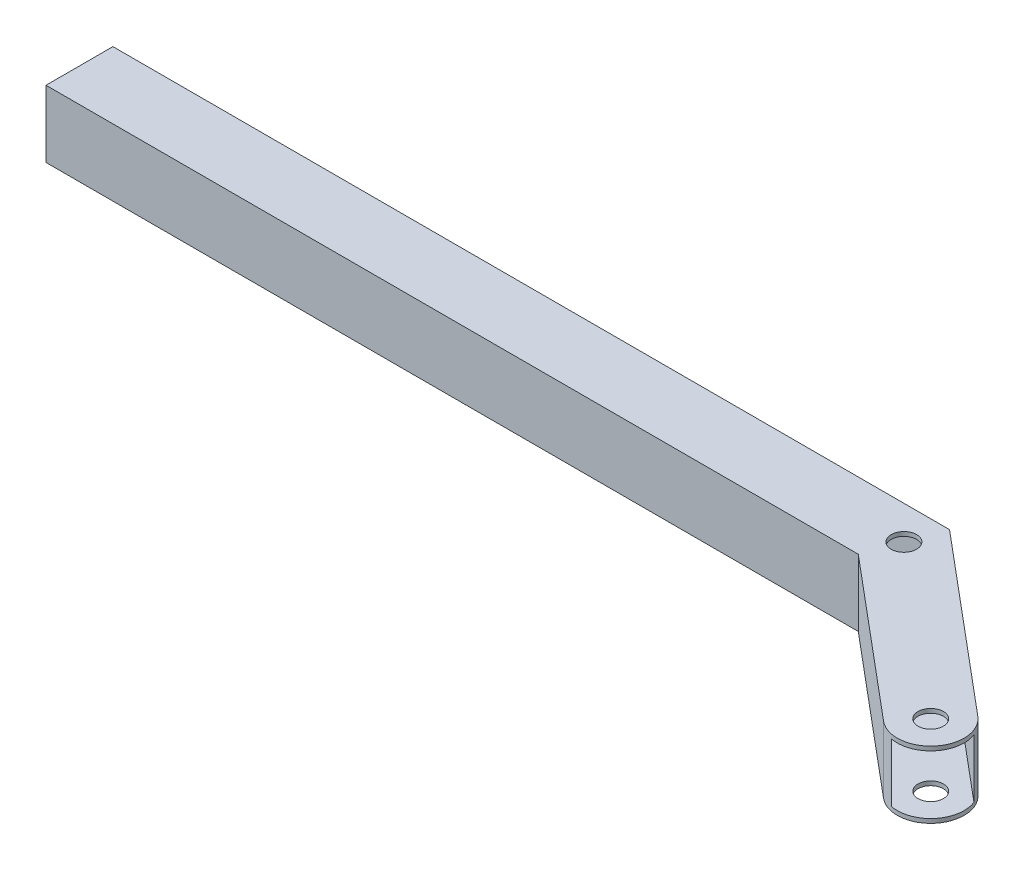
ISO-10303-21;
HEADER;
FILE_DESCRIPTION(('STEP AP214'),'2;1');
FILE_NAME('part.step','',(''),(''),'','','');
FILE_SCHEMA(('AUTOMOTIVE_DESIGN { 1 0 10303 214 1 1 1 1 }'));
ENDSEC;
DATA;
#1=APPLICATION_CONTEXT('core data for automotive mechanical design processes');
#2=APPLICATION_PROTOCOL_DEFINITION('international standard','automotive_design',2000,#1);
#3=PRODUCT_CONTEXT('',#1,'mechanical');
#4=PRODUCT('Part','Part','',(#3));
#5=PRODUCT_RELATED_PRODUCT_CATEGORY('part','',(#4));
#6=PRODUCT_DEFINITION_FORMATION('','',#4);
#7=PRODUCT_DEFINITION_CONTEXT('part definition',#1,'design');
#8=PRODUCT_DEFINITION('design','',#6,#7);
#9=PRODUCT_DEFINITION_SHAPE('','',#8);
#10=(LENGTH_UNIT() NAMED_UNIT(*) SI_UNIT(.MILLI.,.METRE.));
#11=(NAMED_UNIT(*) PLANE_ANGLE_UNIT() SI_UNIT($,.RADIAN.));
#12=(NAMED_UNIT(*) SI_UNIT($,.STERADIAN.) SOLID_ANGLE_UNIT());
#13=UNCERTAINTY_MEASURE_WITH_UNIT(LENGTH_MEASURE(1.E-05),#10,'distance_accuracy_value','');
#14=(GEOMETRIC_REPRESENTATION_CONTEXT(3) GLOBAL_UNCERTAINTY_ASSIGNED_CONTEXT((#13)) GLOBAL_UNIT_ASSIGNED_CONTEXT((#10,
#11,#12)) REPRESENTATION_CONTEXT('',''));
#15=CARTESIAN_POINT('',(0.,0.,0.));
#16=DIRECTION('',(0.,0.,1.));
#17=DIRECTION('',(1.,0.,0.));
#18=AXIS2_PLACEMENT_3D('',#15,#16,#17);
#19=CARTESIAN_POINT('',(189.382955981188,1.5875,1.66702581812776));
#20=DIRECTION('',(0.,-1.,0.));
#21=DIRECTION('',(0.,0.,-1.));
#22=AXIS2_PLACEMENT_3D('',#19,#20,#21);
#23=PLANE('',#22);
#24=CARTESIAN_POINT('',(126.145987201716,1.5875,-51.3950913614962));
#25=DIRECTION('',(0.,-1.,0.));
#26=DIRECTION('',(0.,0.,-1.));
#27=AXIS2_PLACEMENT_3D('',#24,#25,#26);
#28=CIRCLE('',#27,4.82599999999999);
#29=CARTESIAN_POINT('',(126.145987201716,1.5875,-56.2210913614962));
#30=VERTEX_POINT('',#29);
#31=EDGE_CURVE('E390',#30,#30,#28,.T.);
#32=ORIENTED_EDGE('',*,*,#31,.T.);
#33=EDGE_LOOP('',(#32));
#34=FACE_BOUND('',#33,.T.);
#35=CARTESIAN_POINT('',(189.382955981188,1.5875,1.66702581812773));
#36=DIRECTION('',(0.,-1.,0.));
#37=DIRECTION('',(0.,0.,-1.));
#38=AXIS2_PLACEMENT_3D('',#35,#36,#37);
#39=CIRCLE('',#38,4.82599999999999);
#40=CARTESIAN_POINT('',(189.382955981188,1.5875,-3.15897418187226));
#41=VERTEX_POINT('',#40);
#42=EDGE_CURVE('E175',#41,#41,#39,.T.);
#43=ORIENTED_EDGE('',*,*,#42,.T.);
#44=EDGE_LOOP('',(#43));
#45=FACE_BOUND('',#44,.T.);
#46=DIRECTION('',(-0.766044443118976,0.,-0.642787609686541));
#47=VECTOR('',#46,1.);
#48=CARTESIAN_POINT('',(122.101367909716,1.5875,-40.2825913614963));
#49=LINE('',#48,#47);
#50=CARTESIAN_POINT('',(186.949896485493,1.5875,14.1317850488274));
#51=VERTEX_POINT('',#50);
#52=CARTESIAN_POINT('',(122.101367909716,1.5875,-40.2825913614963));
#53=VERTEX_POINT('',#52);
#54=EDGE_CURVE('E55',#51,#53,#49,.T.);
#55=ORIENTED_EDGE('',*,*,#54,.F.);
#56=CARTESIAN_POINT('',(189.382955981188,1.5875,1.66702581812776));
#57=DIRECTION('',(0.,1.,0.));
#58=DIRECTION('',(0.,0.,-1.));
#59=AXIS2_PLACEMENT_3D('',#56,#57,#58);
#60=CIRCLE('',#59,12.7000000468073);
#61=CARTESIAN_POINT('',(201.235851163428,1.5875,-2.89355276224286));
#62=VERTEX_POINT('',#61);
#63=EDGE_CURVE('E261',#51,#62,#60,.T.);
#64=ORIENTED_EDGE('',*,*,#63,.T.);
#65=DIRECTION('',(0.766044443118984,0.,0.642787609686532));
#66=VECTOR('',#65,1.);
#67=CARTESIAN_POINT('',(130.768409293014,1.5875,-62.0227572457122));
#68=LINE('',#67,#66);
#69=CARTESIAN_POINT('',(130.768409293014,1.5875,-62.0227572457122));
#70=VERTEX_POINT('',#69);
#71=EDGE_CURVE('E209',#70,#62,#68,.T.);
#72=ORIENTED_EDGE('',*,*,#71,.F.);
#73=DIRECTION('',(0.,0.,1.));
#74=VECTOR('',#73,1.);
#75=CARTESIAN_POINT('',(130.768409293014,1.5875,-62.0227572457122));
#76=LINE('',#75,#74);
#77=CARTESIAN_POINT('',(130.768409293014,1.5875,-62.5075913614962));
#78=VERTEX_POINT('',#77);
#79=EDGE_CURVE('E236',#78,#70,#76,.T.);
#80=ORIENTED_EDGE('',*,*,#79,.F.);
#81=DIRECTION('',(1.,0.,0.));
#82=VECTOR('',#81,1.);
#83=CARTESIAN_POINT('',(130.190606493716,1.5875,-62.5075913614962));
#84=LINE('',#83,#82);
#85=CARTESIAN_POINT('',(130.190606493716,1.5875,-62.5075913614962));
#86=VERTEX_POINT('',#85);
#87=EDGE_CURVE('E233',#86,#78,#84,.T.);
#88=ORIENTED_EDGE('',*,*,#87,.F.);
#89=DIRECTION('',(0.766044443119002,0.,0.64278760968651));
#90=VECTOR('',#89,1.);
#91=CARTESIAN_POINT('',(129.747983870096,1.5875,-62.878995841727));
#92=LINE('',#91,#90);
#93=CARTESIAN_POINT('',(129.747983870096,1.5875,-62.878995841727));
#94=VERTEX_POINT('',#93);
#95=EDGE_CURVE('E230',#94,#86,#92,.T.);
#96=ORIENTED_EDGE('',*,*,#95,.F.);
#97=DIRECTION('',(0.642787609686567,0.,-0.766044443118955));
#98=VECTOR('',#97,1.);
#99=CARTESIAN_POINT('',(129.436338507716,1.5875,-62.5075913614962));
#100=LINE('',#99,#98);
#101=CARTESIAN_POINT('',(129.436338507716,1.5875,-62.5075913614962));
#102=VERTEX_POINT('',#101);
#103=EDGE_CURVE('E227',#102,#94,#100,.T.);
#104=ORIENTED_EDGE('',*,*,#103,.F.);
#105=DIRECTION('',(1.,0.,0.));
#106=VECTOR('',#105,1.);
#107=CARTESIAN_POINT('',(-186.782012798284,1.5875,-62.5075913614962));
#108=LINE('',#107,#106);
#109=CARTESIAN_POINT('',(-186.782012798284,1.5875,-62.5075913614962));
#110=VERTEX_POINT('',#109);
#111=EDGE_CURVE('E204',#110,#102,#108,.T.);
#112=ORIENTED_EDGE('',*,*,#111,.F.);
#113=DIRECTION('',(0.,0.,1.));
#114=VECTOR('',#113,1.);
#115=CARTESIAN_POINT('',(-186.782012798284,1.5875,-38.6950913614963));
#116=LINE('',#115,#114);
#117=CARTESIAN_POINT('',(-186.782012798284,1.5875,-40.2825913614963));
#118=VERTEX_POINT('',#117);
#119=EDGE_CURVE('E263',#110,#118,#116,.T.);
#120=ORIENTED_EDGE('',*,*,#119,.T.);
#121=DIRECTION('',(-1.,0.,0.));
#122=VECTOR('',#121,1.);
#123=CARTESIAN_POINT('',(-186.782012798284,1.5875,-40.2825913614963));
#124=LINE('',#123,#122);
#125=EDGE_CURVE('E51',#53,#118,#124,.T.);
#126=ORIENTED_EDGE('',*,*,#125,.F.);
#127=EDGE_LOOP('',(#55,#64,#72,#80,#88,#96,#104,#112,#120,#126));
#128=FACE_BOUND('',#127,.T.);
#129=ADVANCED_FACE('F36',(#34,#45,#128),#23,.F.);
#130=CARTESIAN_POINT('',(121.523565153716,1.5875,-38.6950913614963));
#131=DIRECTION('',(0.642787609686541,0.,-0.766044443118976));
#132=DIRECTION('',(-0.766044443118977,0.,-0.642787609686541));
#133=AXIS2_PLACEMENT_3D('',#130,#131,#132);
#134=PLANE('',#133);
#135=DIRECTION('',(0.766044443118977,0.,0.642787609686541));
#136=VECTOR('',#135,1.);
#137=CARTESIAN_POINT('',(121.523565153716,0.,-38.6950913614963));
#138=LINE('',#137,#136);
#139=CARTESIAN_POINT('',(121.523565153716,0.,-38.6950913614963));
#140=VERTEX_POINT('',#139);
#141=CARTESIAN_POINT('',(181.219553308082,0.,11.3957902815952));
#142=VERTEX_POINT('',#141);
#143=EDGE_CURVE('E152',#140,#142,#138,.T.);
#144=ORIENTED_EDGE('',*,*,#143,.T.);
#145=DIRECTION('',(0.,-1.,0.));
#146=VECTOR('',#145,1.);
#147=CARTESIAN_POINT('',(181.219553308082,1.5875,11.3957902815952));
#148=LINE('',#147,#146);
#149=CARTESIAN_POINT('',(181.219553308082,25.4,11.3957902815952));
#150=VERTEX_POINT('',#149);
#151=EDGE_CURVE('E11',#150,#142,#148,.T.);
#152=ORIENTED_EDGE('',*,*,#151,.F.);
#153=DIRECTION('',(0.766044443118977,0.,0.642787609686541));
#154=VECTOR('',#153,1.);
#155=CARTESIAN_POINT('',(121.523565153716,25.4,-38.6950913614963));
#156=LINE('',#155,#154);
#157=CARTESIAN_POINT('',(121.523565153716,25.4,-38.6950913614963));
#158=VERTEX_POINT('',#157);
#159=EDGE_CURVE('E150',#158,#150,#156,.T.);
#160=ORIENTED_EDGE('',*,*,#159,.F.);
#161=DIRECTION('',(0.,-1.,0.));
#162=VECTOR('',#161,1.);
#163=CARTESIAN_POINT('',(121.523565153716,1.5875,-38.6950913614963));
#164=LINE('',#163,#162);
#165=EDGE_CURVE('E266',#158,#140,#164,.T.);
#166=ORIENTED_EDGE('',*,*,#165,.T.);
#167=EDGE_LOOP('',(#144,#152,#160,#166));
#168=FACE_BOUND('',#167,.T.);
#169=ADVANCED_FACE('F38',(#168),#134,.F.);
#170=CARTESIAN_POINT('',(189.382955981188,1.5875,1.66702581812776));
#171=DIRECTION('',(0.,-1.,0.));
#172=DIRECTION('',(0.,0.,-1.));
#173=AXIS2_PLACEMENT_3D('',#170,#171,#172);
#174=CYLINDRICAL_SURFACE('',#173,12.7000000468073);
#175=DIRECTION('',(0.,-1.,0.));
#176=VECTOR('',#175,1.);
#177=CARTESIAN_POINT('',(197.546358654294,1.5875,-8.06173864533968));
#178=LINE('',#177,#176);
#179=CARTESIAN_POINT('',(197.546358654294,25.4,-8.06173864533971));
#180=VERTEX_POINT('',#179);
#181=CARTESIAN_POINT('',(197.546358654294,0.,-8.06173864533968));
#182=VERTEX_POINT('',#181);
#183=EDGE_CURVE('E44',#180,#182,#178,.T.);
#184=ORIENTED_EDGE('',*,*,#183,.F.);
#185=CARTESIAN_POINT('',(189.382955981188,25.4,1.66702581812774));
#186=DIRECTION('',(0.,1.,0.));
#187=DIRECTION('',(0.,0.,-1.));
#188=AXIS2_PLACEMENT_3D('',#185,#186,#187);
#189=CIRCLE('',#188,12.7000000468073);
#190=EDGE_CURVE('E155',#150,#180,#189,.T.);
#191=ORIENTED_EDGE('',*,*,#190,.F.);
#192=ORIENTED_EDGE('',*,*,#151,.T.);
#193=CARTESIAN_POINT('',(189.382955981188,0.,1.66702581812776));
#194=DIRECTION('',(0.,1.,0.));
#195=DIRECTION('',(0.,0.,-1.));
#196=AXIS2_PLACEMENT_3D('',#193,#194,#195);
#197=CIRCLE('',#196,12.7000000468073);
#198=EDGE_CURVE('E268',#142,#182,#197,.T.);
#199=ORIENTED_EDGE('',*,*,#198,.T.);
#200=EDGE_LOOP('',(#184,#191,#192,#199));
#201=FACE_BOUND('',#200,.T.);
#202=CARTESIAN_POINT('',(189.382955981188,23.8125,1.66702581812774));
#203=DIRECTION('',(0.,1.,0.));
#204=DIRECTION('',(0.,0.,-1.));
#205=AXIS2_PLACEMENT_3D('',#202,#203,#204);
#206=CIRCLE('',#205,12.7000000468073);
#207=CARTESIAN_POINT('',(186.949896398707,23.8125,14.1317849760051));
#208=VERTEX_POINT('',#207);
#209=CARTESIAN_POINT('',(201.235851163428,23.8125,-2.89355276224282));
#210=VERTEX_POINT('',#209);
#211=EDGE_CURVE('E172',#208,#210,#206,.T.);
#212=ORIENTED_EDGE('',*,*,#211,.T.);
#213=DIRECTION('',(0.,-1.,0.));
#214=VECTOR('',#213,1.);
#215=CARTESIAN_POINT('',(201.235851163428,23.8125,-2.89355276224282));
#216=LINE('',#215,#214);
#217=EDGE_CURVE('E224',#210,#62,#216,.T.);
#218=ORIENTED_EDGE('',*,*,#217,.T.);
#219=ORIENTED_EDGE('',*,*,#63,.F.);
#220=DIRECTION('',(0.,-1.,0.));
#221=VECTOR('',#220,1.);
#222=CARTESIAN_POINT('',(186.949896398707,23.8125,14.1317849760051));
#223=LINE('',#222,#221);
#224=EDGE_CURVE('E201',#208,#51,#223,.T.);
#225=ORIENTED_EDGE('',*,*,#224,.F.);
#226=EDGE_LOOP('',(#212,#218,#219,#225));
#227=FACE_BOUND('',#226,.T.);
#228=ADVANCED_FACE('F156',(#201,#227),#174,.T.);
#229=CARTESIAN_POINT('',(130.768409249716,1.5875,-64.0950913614962));
#230=DIRECTION('',(-0.642787609686541,0.,0.766044443118977));
#231=DIRECTION('',(0.766044443118977,0.,0.642787609686541));
#232=AXIS2_PLACEMENT_3D('',#229,#230,#231);
#233=PLANE('',#232);
#234=DIRECTION('',(-0.766044443118977,0.,-0.642787609686541));
#235=VECTOR('',#234,1.);
#236=CARTESIAN_POINT('',(130.768409249716,0.,-64.0950913614962));
#237=LINE('',#236,#235);
#238=CARTESIAN_POINT('',(130.768409249716,0.,-64.0950913614962));
#239=VERTEX_POINT('',#238);
#240=EDGE_CURVE('E270',#182,#239,#237,.T.);
#241=ORIENTED_EDGE('',*,*,#240,.T.);
#242=DIRECTION('',(0.,-1.,0.));
#243=VECTOR('',#242,1.);
#244=CARTESIAN_POINT('',(130.768409249716,1.5875,-64.0950913614962));
#245=LINE('',#244,#243);
#246=CARTESIAN_POINT('',(130.768409249716,25.4,-64.0950913614962));
#247=VERTEX_POINT('',#246);
#248=EDGE_CURVE('E284',#247,#239,#245,.T.);
#249=ORIENTED_EDGE('',*,*,#248,.F.);
#250=DIRECTION('',(-0.766044443118977,0.,-0.642787609686541));
#251=VECTOR('',#250,1.);
#252=CARTESIAN_POINT('',(130.768409249716,25.4,-64.0950913614962));
#253=LINE('',#252,#251);
#254=EDGE_CURVE('E162',#180,#247,#253,.T.);
#255=ORIENTED_EDGE('',*,*,#254,.F.);
#256=ORIENTED_EDGE('',*,*,#183,.T.);
#257=EDGE_LOOP('',(#241,#249,#255,#256));
#258=FACE_BOUND('',#257,.T.);
#259=ADVANCED_FACE('F288',(#258),#233,.F.);
#260=CARTESIAN_POINT('',(-186.782012798284,1.5875,-64.0950913614962));
#261=DIRECTION('',(0.,0.,1.));
#262=DIRECTION('',(1.,0.,0.));
#263=AXIS2_PLACEMENT_3D('',#260,#261,#262);
#264=PLANE('',#263);
#265=DIRECTION('',(-1.,0.,0.));
#266=VECTOR('',#265,1.);
#267=CARTESIAN_POINT('',(-186.782012798284,0.,-64.0950913614962));
#268=LINE('',#267,#266);
#269=CARTESIAN_POINT('',(-186.782012798284,0.,-64.0950913614962));
#270=VERTEX_POINT('',#269);
#271=EDGE_CURVE('E272',#239,#270,#268,.T.);
#272=ORIENTED_EDGE('',*,*,#271,.T.);
#273=DIRECTION('',(0.,-1.,0.));
#274=VECTOR('',#273,1.);
#275=CARTESIAN_POINT('',(-186.782012798284,1.5875,-64.0950913614962));
#276=LINE('',#275,#274);
#277=CARTESIAN_POINT('',(-186.782012798284,25.4,-64.0950913614962));
#278=VERTEX_POINT('',#277);
#279=EDGE_CURVE('E281',#278,#270,#276,.T.);
#280=ORIENTED_EDGE('',*,*,#279,.F.);
#281=DIRECTION('',(-1.,0.,0.));
#282=VECTOR('',#281,1.);
#283=CARTESIAN_POINT('',(-186.782012798284,25.4,-64.0950913614962));
#284=LINE('',#283,#282);
#285=EDGE_CURVE('E179',#247,#278,#284,.T.);
#286=ORIENTED_EDGE('',*,*,#285,.F.);
#287=ORIENTED_EDGE('',*,*,#248,.T.);
#288=EDGE_LOOP('',(#272,#280,#286,#287));
#289=FACE_BOUND('',#288,.T.);
#290=ADVANCED_FACE('F295',(#289),#264,.F.);
#291=CARTESIAN_POINT('',(-186.782012798284,1.5875,-38.6950913614963));
#292=DIRECTION('',(1.,0.,0.));
#293=DIRECTION('',(0.,0.,-1.));
#294=AXIS2_PLACEMENT_3D('',#291,#292,#293);
#295=PLANE('',#294);
#296=DIRECTION('',(0.,-1.,0.));
#297=VECTOR('',#296,1.);
#298=CARTESIAN_POINT('',(-186.782012798284,23.8125,-62.5075913614962));
#299=LINE('',#298,#297);
#300=CARTESIAN_POINT('',(-186.782012798284,23.8125,-62.5075913614962));
#301=VERTEX_POINT('',#300);
#302=EDGE_CURVE('E258',#301,#110,#299,.T.);
#303=ORIENTED_EDGE('',*,*,#302,.F.);
#304=DIRECTION('',(0.,0.,1.));
#305=VECTOR('',#304,1.);
#306=CARTESIAN_POINT('',(-186.782012798284,23.8125,-38.6950913614963));
#307=LINE('',#306,#305);
#308=CARTESIAN_POINT('',(-186.782012798284,23.8125,-40.2825913614963));
#309=VERTEX_POINT('',#308);
#310=EDGE_CURVE('E169',#301,#309,#307,.T.);
#311=ORIENTED_EDGE('',*,*,#310,.T.);
#312=DIRECTION('',(0.,-1.,0.));
#313=VECTOR('',#312,1.);
#314=CARTESIAN_POINT('',(-186.782012798284,23.8125,-40.2825913614963));
#315=LINE('',#314,#313);
#316=EDGE_CURVE('E193',#309,#118,#315,.T.);
#317=ORIENTED_EDGE('',*,*,#316,.T.);
#318=ORIENTED_EDGE('',*,*,#119,.F.);
#319=EDGE_LOOP('',(#303,#311,#317,#318));
#320=FACE_BOUND('',#319,.T.);
#321=DIRECTION('',(0.,0.,1.));
#322=VECTOR('',#321,1.);
#323=CARTESIAN_POINT('',(-186.782012798284,0.,-38.6950913614963));
#324=LINE('',#323,#322);
#325=CARTESIAN_POINT('',(-186.782012798284,0.,-38.6950913614963));
#326=VERTEX_POINT('',#325);
#327=EDGE_CURVE('E274',#270,#326,#324,.T.);
#328=ORIENTED_EDGE('',*,*,#327,.T.);
#329=DIRECTION('',(0.,-1.,0.));
#330=VECTOR('',#329,1.);
#331=CARTESIAN_POINT('',(-186.782012798284,1.5875,-38.6950913614963));
#332=LINE('',#331,#330);
#333=CARTESIAN_POINT('',(-186.782012798284,25.4,-38.6950913614963));
#334=VERTEX_POINT('',#333);
#335=EDGE_CURVE('E278',#334,#326,#332,.T.);
#336=ORIENTED_EDGE('',*,*,#335,.F.);
#337=DIRECTION('',(0.,0.,1.));
#338=VECTOR('',#337,1.);
#339=CARTESIAN_POINT('',(-186.782012798284,25.4,-38.6950913614963));
#340=LINE('',#339,#338);
#341=EDGE_CURVE('E182',#278,#334,#340,.T.);
#342=ORIENTED_EDGE('',*,*,#341,.F.);
#343=ORIENTED_EDGE('',*,*,#279,.T.);
#344=EDGE_LOOP('',(#328,#336,#342,#343));
#345=FACE_BOUND('',#344,.T.);
#346=ADVANCED_FACE('F299',(#320,#345),#295,.F.);
#347=CARTESIAN_POINT('',(121.523565153716,1.5875,-38.6950913614963));
#348=DIRECTION('',(0.,0.,-1.));
#349=DIRECTION('',(-1.,0.,0.));
#350=AXIS2_PLACEMENT_3D('',#347,#348,#349);
#351=PLANE('',#350);
#352=DIRECTION('',(1.,0.,0.));
#353=VECTOR('',#352,1.);
#354=CARTESIAN_POINT('',(121.523565153716,0.,-38.6950913614963));
#355=LINE('',#354,#353);
#356=EDGE_CURVE('E264',#326,#140,#355,.T.);
#357=ORIENTED_EDGE('',*,*,#356,.T.);
#358=ORIENTED_EDGE('',*,*,#165,.F.);
#359=DIRECTION('',(1.,0.,0.));
#360=VECTOR('',#359,1.);
#361=CARTESIAN_POINT('',(121.523565153716,25.4,-38.6950913614963));
#362=LINE('',#361,#360);
#363=EDGE_CURVE('E168',#334,#158,#362,.T.);
#364=ORIENTED_EDGE('',*,*,#363,.F.);
#365=ORIENTED_EDGE('',*,*,#335,.T.);
#366=EDGE_LOOP('',(#357,#358,#364,#365));
#367=FACE_BOUND('',#366,.T.);
#368=ADVANCED_FACE('F301',(#367),#351,.F.);
#369=CARTESIAN_POINT('',(189.382955981188,0.,1.66702581812776));
#370=DIRECTION('',(0.,-1.,0.));
#371=DIRECTION('',(0.,0.,-1.));
#372=AXIS2_PLACEMENT_3D('',#369,#370,#371);
#373=PLANE('',#372);
#374=CARTESIAN_POINT('',(126.145987201716,0.,-51.3950913614962));
#375=DIRECTION('',(0.,1.,0.));
#376=DIRECTION('',(0.,0.,1.));
#377=AXIS2_PLACEMENT_3D('',#374,#375,#376);
#378=CIRCLE('',#377,4.82599999999999);
#379=CARTESIAN_POINT('',(126.145987201716,0.,-46.5690913614962));
#380=VERTEX_POINT('',#379);
#381=EDGE_CURVE('E384',#380,#380,#378,.T.);
#382=ORIENTED_EDGE('',*,*,#381,.T.);
#383=EDGE_LOOP('',(#382));
#384=FACE_BOUND('',#383,.T.);
#385=CARTESIAN_POINT('',(189.382955981188,0.,1.66702581812773));
#386=DIRECTION('',(0.,1.,0.));
#387=DIRECTION('',(0.,0.,1.));
#388=AXIS2_PLACEMENT_3D('',#385,#386,#387);
#389=CIRCLE('',#388,4.82599999999999);
#390=CARTESIAN_POINT('',(189.382955981188,0.,6.49302581812772));
#391=VERTEX_POINT('',#390);
#392=EDGE_CURVE('E393',#391,#391,#389,.T.);
#393=ORIENTED_EDGE('',*,*,#392,.T.);
#394=EDGE_LOOP('',(#393));
#395=FACE_BOUND('',#394,.T.);
#396=ORIENTED_EDGE('',*,*,#143,.F.);
#397=ORIENTED_EDGE('',*,*,#356,.F.);
#398=ORIENTED_EDGE('',*,*,#327,.F.);
#399=ORIENTED_EDGE('',*,*,#271,.F.);
#400=ORIENTED_EDGE('',*,*,#240,.F.);
#401=ORIENTED_EDGE('',*,*,#198,.F.);
#402=EDGE_LOOP('',(#396,#397,#398,#399,#400,#401));
#403=FACE_BOUND('',#402,.T.);
#404=ADVANCED_FACE('F291',(#384,#395,#403),#373,.T.);
#405=CARTESIAN_POINT('',(-186.782012798284,23.8125,-62.5075913614962));
#406=DIRECTION('',(0.,0.,-1.));
#407=DIRECTION('',(-1.,0.,0.));
#408=AXIS2_PLACEMENT_3D('',#405,#406,#407);
#409=PLANE('',#408);
#410=ORIENTED_EDGE('',*,*,#111,.T.);
#411=DIRECTION('',(0.,-1.,0.));
#412=VECTOR('',#411,1.);
#413=CARTESIAN_POINT('',(129.436338507716,23.8125,-62.5075913614962));
#414=LINE('',#413,#412);
#415=CARTESIAN_POINT('',(129.436338507716,23.8125,-62.5075913614962));
#416=VERTEX_POINT('',#415);
#417=EDGE_CURVE('E255',#416,#102,#414,.T.);
#418=ORIENTED_EDGE('',*,*,#417,.F.);
#419=DIRECTION('',(1.,0.,0.));
#420=VECTOR('',#419,1.);
#421=CARTESIAN_POINT('',(-186.782012798284,23.8125,-62.5075913614962));
#422=LINE('',#421,#420);
#423=EDGE_CURVE('E205',#301,#416,#422,.T.);
#424=ORIENTED_EDGE('',*,*,#423,.F.);
#425=ORIENTED_EDGE('',*,*,#302,.T.);
#426=EDGE_LOOP('',(#410,#418,#424,#425));
#427=FACE_BOUND('',#426,.T.);
#428=ADVANCED_FACE('F309',(#427),#409,.F.);
#429=CARTESIAN_POINT('',(129.436338507716,23.8125,-62.5075913614962));
#430=DIRECTION('',(-0.766044443118955,0.,-0.642787609686567));
#431=DIRECTION('',(-0.642787609686567,0.,0.766044443118955));
#432=AXIS2_PLACEMENT_3D('',#429,#430,#431);
#433=PLANE('',#432);
#434=ORIENTED_EDGE('',*,*,#103,.T.);
#435=DIRECTION('',(0.,-1.,0.));
#436=VECTOR('',#435,1.);
#437=CARTESIAN_POINT('',(129.747983870096,23.8125,-62.878995841727));
#438=LINE('',#437,#436);
#439=CARTESIAN_POINT('',(129.747983870096,23.8125,-62.878995841727));
#440=VERTEX_POINT('',#439);
#441=EDGE_CURVE('E252',#440,#94,#438,.T.);
#442=ORIENTED_EDGE('',*,*,#441,.F.);
#443=DIRECTION('',(0.642787609686567,0.,-0.766044443118955));
#444=VECTOR('',#443,1.);
#445=CARTESIAN_POINT('',(129.436338507716,23.8125,-62.5075913614962));
#446=LINE('',#445,#444);
#447=EDGE_CURVE('E208',#416,#440,#446,.T.);
#448=ORIENTED_EDGE('',*,*,#447,.F.);
#449=ORIENTED_EDGE('',*,*,#417,.T.);
#450=EDGE_LOOP('',(#434,#442,#448,#449));
#451=FACE_BOUND('',#450,.T.);
#452=ADVANCED_FACE('F326',(#451),#433,.F.);
#453=CARTESIAN_POINT('',(129.747983870096,23.8125,-62.878995841727));
#454=DIRECTION('',(0.642787609686511,0.,-0.766044443119002));
#455=DIRECTION('',(-0.766044443119002,0.,-0.642787609686511));
#456=AXIS2_PLACEMENT_3D('',#453,#454,#455);
#457=PLANE('',#456);
#458=ORIENTED_EDGE('',*,*,#95,.T.);
#459=DIRECTION('',(0.,-1.,0.));
#460=VECTOR('',#459,1.);
#461=CARTESIAN_POINT('',(130.190606493716,23.8125,-62.5075913614962));
#462=LINE('',#461,#460);
#463=CARTESIAN_POINT('',(130.190606493716,23.8125,-62.5075913614962));
#464=VERTEX_POINT('',#463);
#465=EDGE_CURVE('E249',#464,#86,#462,.T.);
#466=ORIENTED_EDGE('',*,*,#465,.F.);
#467=DIRECTION('',(0.766044443119002,0.,0.64278760968651));
#468=VECTOR('',#467,1.);
#469=CARTESIAN_POINT('',(129.747983870096,23.8125,-62.878995841727));
#470=LINE('',#469,#468);
#471=EDGE_CURVE('E212',#440,#464,#470,.T.);
#472=ORIENTED_EDGE('',*,*,#471,.F.);
#473=ORIENTED_EDGE('',*,*,#441,.T.);
#474=EDGE_LOOP('',(#458,#466,#472,#473));
#475=FACE_BOUND('',#474,.T.);
#476=ADVANCED_FACE('F330',(#475),#457,.F.);
#477=CARTESIAN_POINT('',(130.190606493716,23.8125,-62.5075913614962));
#478=DIRECTION('',(0.,0.,-1.));
#479=DIRECTION('',(-1.,0.,0.));
#480=AXIS2_PLACEMENT_3D('',#477,#478,#479);
#481=PLANE('',#480);
#482=ORIENTED_EDGE('',*,*,#87,.T.);
#483=DIRECTION('',(0.,-1.,0.));
#484=VECTOR('',#483,1.);
#485=CARTESIAN_POINT('',(130.768409293014,23.8125,-62.5075913614962));
#486=LINE('',#485,#484);
#487=CARTESIAN_POINT('',(130.768409293014,23.8125,-62.5075913614962));
#488=VERTEX_POINT('',#487);
#489=EDGE_CURVE('E246',#488,#78,#486,.T.);
#490=ORIENTED_EDGE('',*,*,#489,.F.);
#491=DIRECTION('',(1.,0.,0.));
#492=VECTOR('',#491,1.);
#493=CARTESIAN_POINT('',(130.190606493716,23.8125,-62.5075913614962));
#494=LINE('',#493,#492);
#495=EDGE_CURVE('E215',#464,#488,#494,.T.);
#496=ORIENTED_EDGE('',*,*,#495,.F.);
#497=ORIENTED_EDGE('',*,*,#465,.T.);
#498=EDGE_LOOP('',(#482,#490,#496,#497));
#499=FACE_BOUND('',#498,.T.);
#500=ADVANCED_FACE('F334',(#499),#481,.F.);
#501=CARTESIAN_POINT('',(130.768409293014,23.8125,-62.0227572457122));
#502=DIRECTION('',(1.,0.,0.));
#503=DIRECTION('',(0.,0.,-1.));
#504=AXIS2_PLACEMENT_3D('',#501,#502,#503);
#505=PLANE('',#504);
#506=ORIENTED_EDGE('',*,*,#79,.T.);
#507=DIRECTION('',(0.,-1.,0.));
#508=VECTOR('',#507,1.);
#509=CARTESIAN_POINT('',(130.768409293014,23.8125,-62.0227572457122));
#510=LINE('',#509,#508);
#511=CARTESIAN_POINT('',(130.768409293014,23.8125,-62.0227572457122));
#512=VERTEX_POINT('',#511);
#513=EDGE_CURVE('E243',#512,#70,#510,.T.);
#514=ORIENTED_EDGE('',*,*,#513,.F.);
#515=DIRECTION('',(0.,0.,1.));
#516=VECTOR('',#515,1.);
#517=CARTESIAN_POINT('',(130.768409293014,23.8125,-62.0227572457122));
#518=LINE('',#517,#516);
#519=EDGE_CURVE('E218',#488,#512,#518,.T.);
#520=ORIENTED_EDGE('',*,*,#519,.F.);
#521=ORIENTED_EDGE('',*,*,#489,.T.);
#522=EDGE_LOOP('',(#506,#514,#520,#521));
#523=FACE_BOUND('',#522,.T.);
#524=ADVANCED_FACE('F338',(#523),#505,.F.);
#525=CARTESIAN_POINT('',(130.768409293014,23.8125,-62.0227572457122));
#526=DIRECTION('',(0.642787609686532,0.,-0.766044443118984));
#527=DIRECTION('',(-0.766044443118984,0.,-0.642787609686532));
#528=AXIS2_PLACEMENT_3D('',#525,#526,#527);
#529=PLANE('',#528);
#530=ORIENTED_EDGE('',*,*,#71,.T.);
#531=ORIENTED_EDGE('',*,*,#217,.F.);
#532=DIRECTION('',(0.766044443118984,0.,0.642787609686532));
#533=VECTOR('',#532,1.);
#534=CARTESIAN_POINT('',(130.768409293014,23.8125,-62.0227572457122));
#535=LINE('',#534,#533);
#536=EDGE_CURVE('E221',#512,#210,#535,.T.);
#537=ORIENTED_EDGE('',*,*,#536,.F.);
#538=ORIENTED_EDGE('',*,*,#513,.T.);
#539=EDGE_LOOP('',(#530,#531,#537,#538));
#540=FACE_BOUND('',#539,.T.);
#541=ADVANCED_FACE('F342',(#540),#529,.F.);
#542=CARTESIAN_POINT('',(122.101367909716,23.8125,-40.2825913614963));
#543=DIRECTION('',(-0.642787609686541,0.,0.766044443118976));
#544=DIRECTION('',(0.766044443118976,0.,0.642787609686541));
#545=AXIS2_PLACEMENT_3D('',#542,#543,#544);
#546=PLANE('',#545);
#547=ORIENTED_EDGE('',*,*,#54,.T.);
#548=DIRECTION('',(0.,-1.,0.));
#549=VECTOR('',#548,1.);
#550=CARTESIAN_POINT('',(122.101367909716,23.8125,-40.2825913614963));
#551=LINE('',#550,#549);
#552=CARTESIAN_POINT('',(122.101367909716,23.8125,-40.2825913614963));
#553=VERTEX_POINT('',#552);
#554=EDGE_CURVE('E198',#553,#53,#551,.T.);
#555=ORIENTED_EDGE('',*,*,#554,.F.);
#556=DIRECTION('',(-0.766044443118976,0.,-0.642787609686541));
#557=VECTOR('',#556,1.);
#558=CARTESIAN_POINT('',(122.101367909716,23.8125,-40.2825913614963));
#559=LINE('',#558,#557);
#560=EDGE_CURVE('E187',#208,#553,#559,.T.);
#561=ORIENTED_EDGE('',*,*,#560,.F.);
#562=ORIENTED_EDGE('',*,*,#224,.T.);
#563=EDGE_LOOP('',(#547,#555,#561,#562));
#564=FACE_BOUND('',#563,.T.);
#565=ADVANCED_FACE('F346',(#564),#546,.F.);
#566=CARTESIAN_POINT('',(-186.782012798284,23.8125,-40.2825913614963));
#567=DIRECTION('',(0.,0.,1.));
#568=DIRECTION('',(1.,0.,0.));
#569=AXIS2_PLACEMENT_3D('',#566,#567,#568);
#570=PLANE('',#569);
#571=ORIENTED_EDGE('',*,*,#125,.T.);
#572=ORIENTED_EDGE('',*,*,#316,.F.);
#573=DIRECTION('',(-1.,0.,0.));
#574=VECTOR('',#573,1.);
#575=CARTESIAN_POINT('',(-186.782012798284,23.8125,-40.2825913614963));
#576=LINE('',#575,#574);
#577=EDGE_CURVE('E190',#553,#309,#576,.T.);
#578=ORIENTED_EDGE('',*,*,#577,.F.);
#579=ORIENTED_EDGE('',*,*,#554,.T.);
#580=EDGE_LOOP('',(#571,#572,#578,#579));
#581=FACE_BOUND('',#580,.T.);
#582=ADVANCED_FACE('F350',(#581),#570,.F.);
#583=CARTESIAN_POINT('',(189.382955981188,23.8125,1.66702581812774));
#584=DIRECTION('',(0.,-1.,0.));
#585=DIRECTION('',(0.,0.,-1.));
#586=AXIS2_PLACEMENT_3D('',#583,#584,#585);
#587=PLANE('',#586);
#588=CARTESIAN_POINT('',(126.145987201716,23.8125,-51.3950913614962));
#589=DIRECTION('',(0.,-1.,0.));
#590=DIRECTION('',(0.,0.,-1.));
#591=AXIS2_PLACEMENT_3D('',#588,#589,#590);
#592=CIRCLE('',#591,4.82599999999999);
#593=CARTESIAN_POINT('',(126.145987201716,23.8125,-56.2210913614962));
#594=VERTEX_POINT('',#593);
#595=EDGE_CURVE('E380',#594,#594,#592,.T.);
#596=ORIENTED_EDGE('',*,*,#595,.F.);
#597=EDGE_LOOP('',(#596));
#598=FACE_BOUND('',#597,.T.);
#599=CARTESIAN_POINT('',(189.382955981188,23.8125,1.66702581812773));
#600=DIRECTION('',(0.,-1.,0.));
#601=DIRECTION('',(0.,0.,-1.));
#602=AXIS2_PLACEMENT_3D('',#599,#600,#601);
#603=CIRCLE('',#602,4.82599999999999);
#604=CARTESIAN_POINT('',(189.382955981188,23.8125,-3.15897418187226));
#605=VERTEX_POINT('',#604);
#606=EDGE_CURVE('E396',#605,#605,#603,.T.);
#607=ORIENTED_EDGE('',*,*,#606,.F.);
#608=EDGE_LOOP('',(#607));
#609=FACE_BOUND('',#608,.T.);
#610=ORIENTED_EDGE('',*,*,#423,.T.);
#611=ORIENTED_EDGE('',*,*,#447,.T.);
#612=ORIENTED_EDGE('',*,*,#471,.T.);
#613=ORIENTED_EDGE('',*,*,#495,.T.);
#614=ORIENTED_EDGE('',*,*,#519,.T.);
#615=ORIENTED_EDGE('',*,*,#536,.T.);
#616=ORIENTED_EDGE('',*,*,#211,.F.);
#617=ORIENTED_EDGE('',*,*,#560,.T.);
#618=ORIENTED_EDGE('',*,*,#577,.T.);
#619=ORIENTED_EDGE('',*,*,#310,.F.);
#620=EDGE_LOOP('',(#610,#611,#612,#613,#614,#615,#616,#617,#618,#619));
#621=FACE_BOUND('',#620,.T.);
#622=ADVANCED_FACE('F354',(#598,#609,#621),#587,.T.);
#623=CARTESIAN_POINT('',(189.382955981188,25.4,1.66702581812774));
#624=DIRECTION('',(0.,-1.,0.));
#625=DIRECTION('',(0.,0.,-1.));
#626=AXIS2_PLACEMENT_3D('',#623,#624,#625);
#627=PLANE('',#626);
#628=CARTESIAN_POINT('',(126.145987201716,25.4,-51.3950913614962));
#629=DIRECTION('',(0.,1.,0.));
#630=DIRECTION('',(0.,0.,1.));
#631=AXIS2_PLACEMENT_3D('',#628,#629,#630);
#632=CIRCLE('',#631,4.82599999999999);
#633=CARTESIAN_POINT('',(126.145987201716,25.4,-46.5690913614962));
#634=VERTEX_POINT('',#633);
#635=EDGE_CURVE('E383',#634,#634,#632,.T.);
#636=ORIENTED_EDGE('',*,*,#635,.F.);
#637=EDGE_LOOP('',(#636));
#638=FACE_BOUND('',#637,.T.);
#639=CARTESIAN_POINT('',(189.382955981188,25.4,1.66702581812773));
#640=DIRECTION('',(0.,1.,0.));
#641=DIRECTION('',(0.,0.,1.));
#642=AXIS2_PLACEMENT_3D('',#639,#640,#641);
#643=CIRCLE('',#642,4.82599999999999);
#644=CARTESIAN_POINT('',(189.382955981188,25.4,6.49302581812772));
#645=VERTEX_POINT('',#644);
#646=EDGE_CURVE('E392',#645,#645,#643,.T.);
#647=ORIENTED_EDGE('',*,*,#646,.F.);
#648=EDGE_LOOP('',(#647));
#649=FACE_BOUND('',#648,.T.);
#650=ORIENTED_EDGE('',*,*,#159,.T.);
#651=ORIENTED_EDGE('',*,*,#190,.T.);
#652=ORIENTED_EDGE('',*,*,#254,.T.);
#653=ORIENTED_EDGE('',*,*,#285,.T.);
#654=ORIENTED_EDGE('',*,*,#341,.T.);
#655=ORIENTED_EDGE('',*,*,#363,.T.);
#656=EDGE_LOOP('',(#650,#651,#652,#653,#654,#655));
#657=FACE_BOUND('',#656,.T.);
#658=ADVANCED_FACE('F165',(#638,#649,#657),#627,.F.);
#659=CARTESIAN_POINT('',(189.382955981188,0.,1.66702581812773));
#660=DIRECTION('',(0.,1.,0.));
#661=DIRECTION('',(0.,0.,1.));
#662=AXIS2_PLACEMENT_3D('',#659,#660,#661);
#663=CYLINDRICAL_SURFACE('',#662,4.82599999999999);
#664=ORIENTED_EDGE('',*,*,#606,.T.);
#665=EDGE_LOOP('',(#664));
#666=FACE_BOUND('',#665,.T.);
#667=ORIENTED_EDGE('',*,*,#646,.T.);
#668=EDGE_LOOP('',(#667));
#669=FACE_BOUND('',#668,.T.);
#670=ADVANCED_FACE('F361',(#666,#669),#663,.F.);
#671=ORIENTED_EDGE('',*,*,#392,.F.);
#672=EDGE_LOOP('',(#671));
#673=FACE_BOUND('',#672,.T.);
#674=ORIENTED_EDGE('',*,*,#42,.F.);
#675=EDGE_LOOP('',(#674));
#676=FACE_BOUND('',#675,.T.);
#677=ADVANCED_FACE('F365',(#673,#676),#663,.F.);
#678=CARTESIAN_POINT('',(126.145987201716,0.,-51.3950913614962));
#679=DIRECTION('',(0.,1.,0.));
#680=DIRECTION('',(0.,0.,1.));
#681=AXIS2_PLACEMENT_3D('',#678,#679,#680);
#682=CYLINDRICAL_SURFACE('',#681,4.82599999999999);
#683=ORIENTED_EDGE('',*,*,#595,.T.);
#684=EDGE_LOOP('',(#683));
#685=FACE_BOUND('',#684,.T.);
#686=ORIENTED_EDGE('',*,*,#635,.T.);
#687=EDGE_LOOP('',(#686));
#688=FACE_BOUND('',#687,.T.);
#689=ADVANCED_FACE('F367',(#685,#688),#682,.F.);
#690=ORIENTED_EDGE('',*,*,#381,.F.);
#691=EDGE_LOOP('',(#690));
#692=FACE_BOUND('',#691,.T.);
#693=ORIENTED_EDGE('',*,*,#31,.F.);
#694=EDGE_LOOP('',(#693));
#695=FACE_BOUND('',#694,.T.);
#696=ADVANCED_FACE('F369',(#692,#695),#682,.F.);
#697=CLOSED_SHELL('',(#129,#169,#228,#259,#290,#346,#368,#404,#428,#452,#476,#500,#524,#541,
#565,#582,#622,#658,#670,#677,#689,#696));
#698=MANIFOLD_SOLID_BREP('B2',#697);
#699=ADVANCED_BREP_SHAPE_REPRESENTATION('',(#18,#698),#14);
#700=SHAPE_DEFINITION_REPRESENTATION(#9,#699);
ENDSEC;
END-ISO-10303-21;
